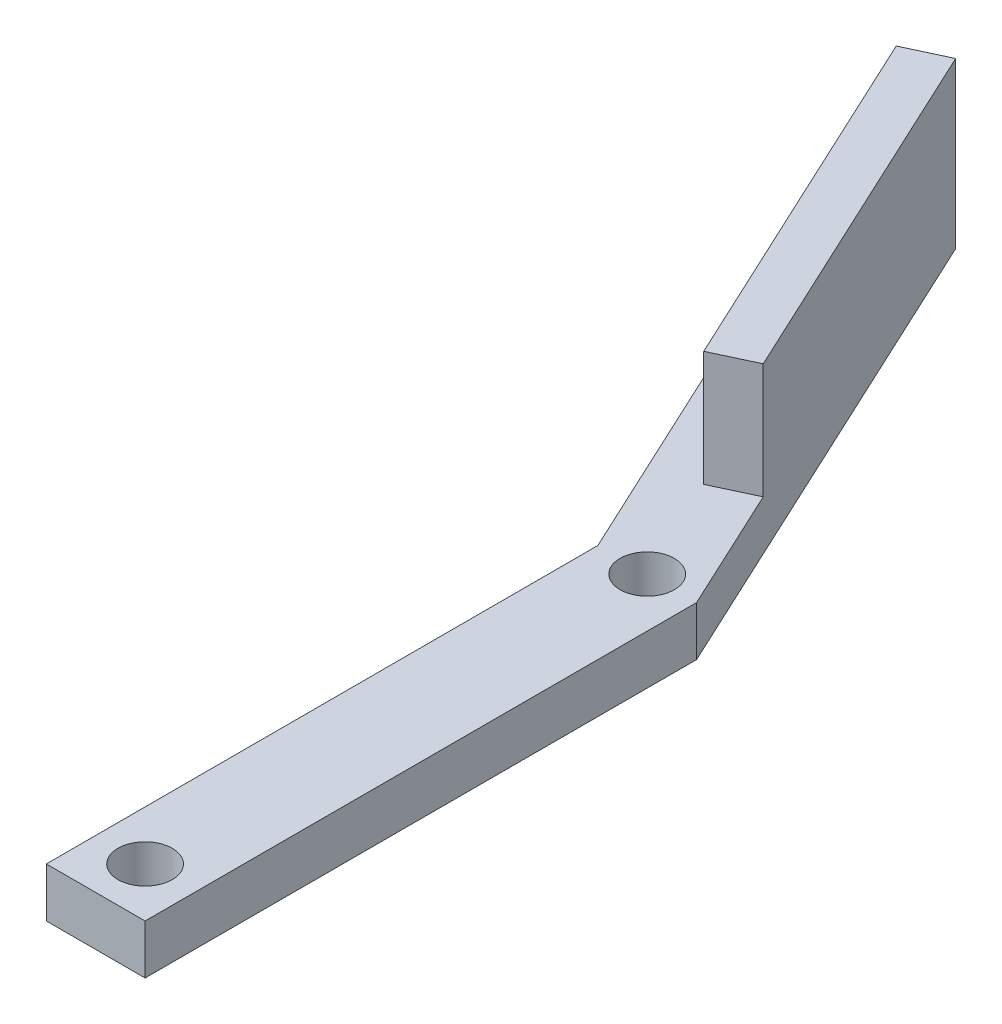
ISO-10303-21;
HEADER;
FILE_DESCRIPTION(('STEP AP214'),'2;1');
FILE_NAME('part.step','',(''),(''),'','','');
FILE_SCHEMA(('AUTOMOTIVE_DESIGN { 1 0 10303 214 1 1 1 1 }'));
ENDSEC;
DATA;
#1=APPLICATION_CONTEXT('core data for automotive mechanical design processes');
#2=APPLICATION_PROTOCOL_DEFINITION('international standard','automotive_design',2000,#1);
#3=PRODUCT_CONTEXT('',#1,'mechanical');
#4=PRODUCT('Part','Part','',(#3));
#5=PRODUCT_RELATED_PRODUCT_CATEGORY('part','',(#4));
#6=PRODUCT_DEFINITION_FORMATION('','',#4);
#7=PRODUCT_DEFINITION_CONTEXT('part definition',#1,'design');
#8=PRODUCT_DEFINITION('design','',#6,#7);
#9=PRODUCT_DEFINITION_SHAPE('','',#8);
#10=(LENGTH_UNIT() NAMED_UNIT(*) SI_UNIT(.MILLI.,.METRE.));
#11=(NAMED_UNIT(*) PLANE_ANGLE_UNIT() SI_UNIT($,.RADIAN.));
#12=(NAMED_UNIT(*) SI_UNIT($,.STERADIAN.) SOLID_ANGLE_UNIT());
#13=UNCERTAINTY_MEASURE_WITH_UNIT(LENGTH_MEASURE(1.E-05),#10,'distance_accuracy_value','');
#14=(GEOMETRIC_REPRESENTATION_CONTEXT(3) GLOBAL_UNCERTAINTY_ASSIGNED_CONTEXT((#13)) GLOBAL_UNIT_ASSIGNED_CONTEXT((#10,
#11,#12)) REPRESENTATION_CONTEXT('',''));
#15=CARTESIAN_POINT('',(0.,0.,0.));
#16=DIRECTION('',(0.,0.,1.));
#17=DIRECTION('',(1.,0.,0.));
#18=AXIS2_PLACEMENT_3D('',#15,#16,#17);
#19=CARTESIAN_POINT('',(-24.896544195256,3.,-53.3908113234974));
#20=DIRECTION('',(0.422618261740706,0.,0.906307787036647));
#21=DIRECTION('',(0.906307787036647,0.,-0.422618261740706));
#22=AXIS2_PLACEMENT_3D('',#19,#20,#21);
#23=PLANE('',#22);
#24=DIRECTION('',(-0.906307787036647,0.,0.422618261740706));
#25=VECTOR('',#24,1.);
#26=CARTESIAN_POINT('',(-24.896544195256,0.,-53.3908113234974));
#27=LINE('',#26,#25);
#28=CARTESIAN_POINT('',(-10.7501850231616,0.,-59.9873669404564));
#29=VERTEX_POINT('',#28);
#30=CARTESIAN_POINT('',(-15.6785478522212,0.,-57.6892336110994));
#31=VERTEX_POINT('',#30);
#32=EDGE_CURVE('E127',#29,#31,#27,.T.);
#33=ORIENTED_EDGE('',*,*,#32,.T.);
#34=DIRECTION('',(0.,-1.,0.));
#35=VECTOR('',#34,1.);
#36=CARTESIAN_POINT('',(-15.6785478522212,3.,-57.6892336110994));
#37=LINE('',#36,#35);
#38=CARTESIAN_POINT('',(-15.6785478522212,3.,-57.6892336110994));
#39=VERTEX_POINT('',#38);
#40=EDGE_CURVE('E11',#39,#31,#37,.T.);
#41=ORIENTED_EDGE('',*,*,#40,.F.);
#42=DIRECTION('',(-0.906307787036647,0.,0.422618261740706));
#43=VECTOR('',#42,1.);
#44=CARTESIAN_POINT('',(-24.896544195256,3.,-53.3908113234974));
#45=LINE('',#44,#43);
#46=CARTESIAN_POINT('',(-13.2143664376914,3.,-58.8383002757779));
#47=VERTEX_POINT('',#46);
#48=EDGE_CURVE('E113',#47,#39,#45,.T.);
#49=ORIENTED_EDGE('',*,*,#48,.F.);
#50=DIRECTION('',(0.,-1.,0.));
#51=VECTOR('',#50,1.);
#52=CARTESIAN_POINT('',(-13.2143664376914,10.,-58.8383002757779));
#53=LINE('',#52,#51);
#54=CARTESIAN_POINT('',(-13.2143664376914,10.,-58.8383002757779));
#55=VERTEX_POINT('',#54);
#56=EDGE_CURVE('E315',#55,#47,#53,.T.);
#57=ORIENTED_EDGE('',*,*,#56,.F.);
#58=DIRECTION('',(-0.906307787036647,0.,0.422618261740706));
#59=VECTOR('',#58,1.);
#60=CARTESIAN_POINT('',(-24.896544195256,10.,-53.3908113234974));
#61=LINE('',#60,#59);
#62=CARTESIAN_POINT('',(-10.7501850231616,10.,-59.9873669404564));
#63=VERTEX_POINT('',#62);
#64=EDGE_CURVE('E284',#63,#55,#61,.T.);
#65=ORIENTED_EDGE('',*,*,#64,.F.);
#66=DIRECTION('',(0.,-1.,0.));
#67=VECTOR('',#66,1.);
#68=CARTESIAN_POINT('',(-10.7501850231616,10.,-59.9873669404564));
#69=LINE('',#68,#67);
#70=EDGE_CURVE('E299',#63,#29,#69,.T.);
#71=ORIENTED_EDGE('',*,*,#70,.T.);
#72=EDGE_LOOP('',(#33,#41,#49,#57,#65,#71));
#73=FACE_BOUND('',#72,.T.);
#74=ADVANCED_FACE('F36',(#73),#23,.F.);
#75=CARTESIAN_POINT('',(9.21799634303479,3.,-4.29842228760199));
#76=DIRECTION('',(0.906307787036646,0.,-0.422618261740707));
#77=DIRECTION('',(-0.422618261740707,0.,-0.906307787036646));
#78=AXIS2_PLACEMENT_3D('',#75,#76,#77);
#79=PLANE('',#78);
#80=DIRECTION('',(0.422618261740707,0.,0.906307787036646));
#81=VECTOR('',#80,1.);
#82=CARTESIAN_POINT('',(9.21799634303479,0.,-4.29842228760199));
#83=LINE('',#82,#81);
#84=CARTESIAN_POINT('',(-3.,0.,-30.5));
#85=VERTEX_POINT('',#84);
#86=EDGE_CURVE('E131',#31,#85,#83,.T.);
#87=ORIENTED_EDGE('',*,*,#86,.T.);
#88=DIRECTION('',(0.,-1.,0.));
#89=VECTOR('',#88,1.);
#90=CARTESIAN_POINT('',(-3.,3.,-30.5));
#91=LINE('',#90,#89);
#92=CARTESIAN_POINT('',(-3.,3.,-30.5));
#93=VERTEX_POINT('',#92);
#94=EDGE_CURVE('E45',#93,#85,#91,.T.);
#95=ORIENTED_EDGE('',*,*,#94,.F.);
#96=DIRECTION('',(0.422618261740707,0.,0.906307787036646));
#97=VECTOR('',#96,1.);
#98=CARTESIAN_POINT('',(9.21799634303479,3.,-4.29842228760199));
#99=LINE('',#98,#97);
#100=EDGE_CURVE('E84',#39,#93,#99,.T.);
#101=ORIENTED_EDGE('',*,*,#100,.F.);
#102=ORIENTED_EDGE('',*,*,#40,.T.);
#103=EDGE_LOOP('',(#87,#95,#101,#102));
#104=FACE_BOUND('',#103,.T.);
#105=ADVANCED_FACE('F147',(#104),#79,.F.);
#106=CARTESIAN_POINT('',(-3.,3.,0.));
#107=DIRECTION('',(-1.,0.,0.));
#108=DIRECTION('',(0.,0.,1.));
#109=AXIS2_PLACEMENT_3D('',#106,#107,#108);
#110=PLANE('',#109);
#111=DIRECTION('',(0.,0.,-1.));
#112=VECTOR('',#111,1.);
#113=CARTESIAN_POINT('',(-3.,0.,0.));
#114=LINE('',#113,#112);
#115=CARTESIAN_POINT('',(-3.,0.,3.));
#116=VERTEX_POINT('',#115);
#117=EDGE_CURVE('E99',#116,#85,#114,.T.);
#118=ORIENTED_EDGE('',*,*,#117,.F.);
#119=DIRECTION('',(0.,-1.,0.));
#120=VECTOR('',#119,1.);
#121=CARTESIAN_POINT('',(-3.,3.,3.));
#122=LINE('',#121,#120);
#123=CARTESIAN_POINT('',(-3.,3.,3.));
#124=VERTEX_POINT('',#123);
#125=EDGE_CURVE('E93',#124,#116,#122,.T.);
#126=ORIENTED_EDGE('',*,*,#125,.F.);
#127=DIRECTION('',(0.,0.,-1.));
#128=VECTOR('',#127,1.);
#129=CARTESIAN_POINT('',(-3.,3.,0.));
#130=LINE('',#129,#128);
#131=EDGE_CURVE('E97',#124,#93,#130,.T.);
#132=ORIENTED_EDGE('',*,*,#131,.T.);
#133=ORIENTED_EDGE('',*,*,#94,.T.);
#134=EDGE_LOOP('',(#118,#126,#132,#133));
#135=FACE_BOUND('',#134,.T.);
#136=ADVANCED_FACE('F95',(#135),#110,.T.);
#137=CARTESIAN_POINT('',(0.,3.,3.));
#138=DIRECTION('',(0.,0.,-1.));
#139=DIRECTION('',(-1.,0.,0.));
#140=AXIS2_PLACEMENT_3D('',#137,#138,#139);
#141=PLANE('',#140);
#142=DIRECTION('',(1.,0.,0.));
#143=VECTOR('',#142,1.);
#144=CARTESIAN_POINT('',(0.,0.,3.));
#145=LINE('',#144,#143);
#146=CARTESIAN_POINT('',(3.,0.,3.));
#147=VERTEX_POINT('',#146);
#148=EDGE_CURVE('E135',#116,#147,#145,.T.);
#149=ORIENTED_EDGE('',*,*,#148,.T.);
#150=DIRECTION('',(0.,-1.,0.));
#151=VECTOR('',#150,1.);
#152=CARTESIAN_POINT('',(3.,3.,3.));
#153=LINE('',#152,#151);
#154=CARTESIAN_POINT('',(3.,3.,3.));
#155=VERTEX_POINT('',#154);
#156=EDGE_CURVE('E72',#155,#147,#153,.T.);
#157=ORIENTED_EDGE('',*,*,#156,.F.);
#158=DIRECTION('',(1.,0.,0.));
#159=VECTOR('',#158,1.);
#160=CARTESIAN_POINT('',(0.,3.,3.));
#161=LINE('',#160,#159);
#162=EDGE_CURVE('E103',#124,#155,#161,.T.);
#163=ORIENTED_EDGE('',*,*,#162,.F.);
#164=ORIENTED_EDGE('',*,*,#125,.T.);
#165=EDGE_LOOP('',(#149,#157,#163,#164));
#166=FACE_BOUND('',#165,.T.);
#167=ADVANCED_FACE('F104',(#166),#141,.F.);
#168=CARTESIAN_POINT('',(3.,3.,0.));
#169=DIRECTION('',(1.,0.,0.));
#170=DIRECTION('',(0.,0.,-1.));
#171=AXIS2_PLACEMENT_3D('',#168,#169,#170);
#172=PLANE('',#171);
#173=DIRECTION('',(0.,0.,1.));
#174=VECTOR('',#173,1.);
#175=CARTESIAN_POINT('',(3.,0.,0.));
#176=LINE('',#175,#174);
#177=CARTESIAN_POINT('',(3.,0.,-30.5));
#178=VERTEX_POINT('',#177);
#179=EDGE_CURVE('E137',#178,#147,#176,.T.);
#180=ORIENTED_EDGE('',*,*,#179,.F.);
#181=DIRECTION('',(0.,-1.,0.));
#182=VECTOR('',#181,1.);
#183=CARTESIAN_POINT('',(3.,3.,-30.5));
#184=LINE('',#183,#182);
#185=CARTESIAN_POINT('',(3.,3.,-30.5));
#186=VERTEX_POINT('',#185);
#187=EDGE_CURVE('E53',#186,#178,#184,.T.);
#188=ORIENTED_EDGE('',*,*,#187,.F.);
#189=DIRECTION('',(0.,0.,1.));
#190=VECTOR('',#189,1.);
#191=CARTESIAN_POINT('',(3.,3.,0.));
#192=LINE('',#191,#190);
#193=EDGE_CURVE('E107',#186,#155,#192,.T.);
#194=ORIENTED_EDGE('',*,*,#193,.T.);
#195=ORIENTED_EDGE('',*,*,#156,.T.);
#196=EDGE_LOOP('',(#180,#188,#194,#195));
#197=FACE_BOUND('',#196,.T.);
#198=ADVANCED_FACE('F153',(#197),#172,.T.);
#199=CARTESIAN_POINT('',(14.1463591720944,3.,-6.59655561695895));
#200=DIRECTION('',(-0.906307787036647,0.,0.422618261740707));
#201=DIRECTION('',(0.422618261740707,0.,0.906307787036647));
#202=AXIS2_PLACEMENT_3D('',#199,#200,#201);
#203=PLANE('',#202);
#204=DIRECTION('',(-0.422618261740707,0.,-0.906307787036646));
#205=VECTOR('',#204,1.);
#206=CARTESIAN_POINT('',(14.1463591720944,0.,-6.59655561695895));
#207=LINE('',#206,#205);
#208=EDGE_CURVE('E140',#178,#29,#207,.T.);
#209=ORIENTED_EDGE('',*,*,#208,.T.);
#210=ORIENTED_EDGE('',*,*,#70,.F.);
#211=DIRECTION('',(-0.422618261740707,0.,-0.906307787036646));
#212=VECTOR('',#211,1.);
#213=CARTESIAN_POINT('',(14.1463591720944,10.,-6.59655561695895));
#214=LINE('',#213,#212);
#215=CARTESIAN_POINT('',(-0.535818585470212,10.,-38.082587426207));
#216=VERTEX_POINT('',#215);
#217=EDGE_CURVE('E313',#216,#63,#214,.T.);
#218=ORIENTED_EDGE('',*,*,#217,.F.);
#219=DIRECTION('',(0.,-1.,0.));
#220=VECTOR('',#219,1.);
#221=CARTESIAN_POINT('',(-0.535818585470212,10.,-38.082587426207));
#222=LINE('',#221,#220);
#223=CARTESIAN_POINT('',(-0.535818585470212,3.,-38.082587426207));
#224=VERTEX_POINT('',#223);
#225=EDGE_CURVE('E296',#216,#224,#222,.T.);
#226=ORIENTED_EDGE('',*,*,#225,.T.);
#227=DIRECTION('',(-0.422618261740707,0.,-0.906307787036646));
#228=VECTOR('',#227,1.);
#229=CARTESIAN_POINT('',(14.1463591720944,3.,-6.59655561695895));
#230=LINE('',#229,#228);
#231=EDGE_CURVE('E118',#186,#224,#230,.T.);
#232=ORIENTED_EDGE('',*,*,#231,.F.);
#233=ORIENTED_EDGE('',*,*,#187,.T.);
#234=EDGE_LOOP('',(#209,#210,#218,#226,#232,#233));
#235=FACE_BOUND('',#234,.T.);
#236=ADVANCED_FACE('F155',(#235),#203,.F.);
#237=CARTESIAN_POINT('',(0.,3.,-30.5));
#238=DIRECTION('',(0.,-1.,0.));
#239=DIRECTION('',(0.,0.,-1.));
#240=AXIS2_PLACEMENT_3D('',#237,#238,#239);
#241=CYLINDRICAL_SURFACE('',#240,1.65);
#242=CARTESIAN_POINT('',(0.,3.,-30.5));
#243=DIRECTION('',(0.,1.,0.));
#244=DIRECTION('',(0.,0.,1.));
#245=AXIS2_PLACEMENT_3D('',#242,#243,#244);
#246=CIRCLE('',#245,1.65);
#247=CARTESIAN_POINT('',(0.,3.,-28.85));
#248=VERTEX_POINT('',#247);
#249=EDGE_CURVE('E145',#248,#248,#246,.T.);
#250=ORIENTED_EDGE('',*,*,#249,.T.);
#251=EDGE_LOOP('',(#250));
#252=FACE_BOUND('',#251,.T.);
#253=CARTESIAN_POINT('',(0.,0.,-30.5));
#254=DIRECTION('',(0.,1.,0.));
#255=DIRECTION('',(0.,0.,1.));
#256=AXIS2_PLACEMENT_3D('',#253,#254,#255);
#257=CIRCLE('',#256,1.65);
#258=CARTESIAN_POINT('',(0.,0.,-28.85));
#259=VERTEX_POINT('',#258);
#260=EDGE_CURVE('E124',#259,#259,#257,.T.);
#261=ORIENTED_EDGE('',*,*,#260,.F.);
#262=EDGE_LOOP('',(#261));
#263=FACE_BOUND('',#262,.T.);
#264=ADVANCED_FACE('F38',(#252,#263),#241,.F.);
#265=CARTESIAN_POINT('',(0.,3.,0.));
#266=DIRECTION('',(0.,-1.,0.));
#267=DIRECTION('',(0.,0.,-1.));
#268=AXIS2_PLACEMENT_3D('',#265,#266,#267);
#269=CYLINDRICAL_SURFACE('',#268,1.65);
#270=CARTESIAN_POINT('',(0.,3.,0.));
#271=DIRECTION('',(0.,1.,0.));
#272=DIRECTION('',(0.,0.,1.));
#273=AXIS2_PLACEMENT_3D('',#270,#271,#272);
#274=CIRCLE('',#273,1.65);
#275=CARTESIAN_POINT('',(0.,3.,1.65));
#276=VERTEX_POINT('',#275);
#277=EDGE_CURVE('E121',#276,#276,#274,.T.);
#278=ORIENTED_EDGE('',*,*,#277,.T.);
#279=EDGE_LOOP('',(#278));
#280=FACE_BOUND('',#279,.T.);
#281=CARTESIAN_POINT('',(0.,0.,0.));
#282=DIRECTION('',(0.,1.,0.));
#283=DIRECTION('',(0.,0.,1.));
#284=AXIS2_PLACEMENT_3D('',#281,#282,#283);
#285=CIRCLE('',#284,1.65);
#286=CARTESIAN_POINT('',(0.,0.,1.65));
#287=VERTEX_POINT('',#286);
#288=EDGE_CURVE('E142',#287,#287,#285,.T.);
#289=ORIENTED_EDGE('',*,*,#288,.F.);
#290=EDGE_LOOP('',(#289));
#291=FACE_BOUND('',#290,.T.);
#292=ADVANCED_FACE('F194',(#280,#291),#269,.F.);
#293=CARTESIAN_POINT('',(0.,3.,0.));
#294=DIRECTION('',(0.,1.,0.));
#295=DIRECTION('',(0.,0.,1.));
#296=AXIS2_PLACEMENT_3D('',#293,#294,#295);
#297=PLANE('',#296);
#298=ORIENTED_EDGE('',*,*,#249,.F.);
#299=EDGE_LOOP('',(#298));
#300=FACE_BOUND('',#299,.T.);
#301=DIRECTION('',(0.906307787036646,0.,-0.422618261740707));
#302=VECTOR('',#301,1.);
#303=CARTESIAN_POINT('',(-14.6821777575646,3.,-31.4860318092481));
#304=LINE('',#303,#302);
#305=CARTESIAN_POINT('',(-3.,3.,-36.9335207615285));
#306=VERTEX_POINT('',#305);
#307=EDGE_CURVE('E305',#306,#224,#304,.T.);
#308=ORIENTED_EDGE('',*,*,#307,.F.);
#309=DIRECTION('',(0.422618261740707,0.,0.906307787036646));
#310=VECTOR('',#309,1.);
#311=CARTESIAN_POINT('',(11.6821777575646,3.,-5.44748895228047));
#312=LINE('',#311,#310);
#313=EDGE_CURVE('E294',#47,#306,#312,.T.);
#314=ORIENTED_EDGE('',*,*,#313,.F.);
#315=ORIENTED_EDGE('',*,*,#48,.T.);
#316=ORIENTED_EDGE('',*,*,#100,.T.);
#317=ORIENTED_EDGE('',*,*,#131,.F.);
#318=ORIENTED_EDGE('',*,*,#162,.T.);
#319=ORIENTED_EDGE('',*,*,#193,.F.);
#320=ORIENTED_EDGE('',*,*,#231,.T.);
#321=EDGE_LOOP('',(#308,#314,#315,#316,#317,#318,#319,#320));
#322=FACE_BOUND('',#321,.T.);
#323=ORIENTED_EDGE('',*,*,#277,.F.);
#324=EDGE_LOOP('',(#323));
#325=FACE_BOUND('',#324,.T.);
#326=ADVANCED_FACE('F110',(#300,#322,#325),#297,.T.);
#327=CARTESIAN_POINT('',(0.,0.,0.));
#328=DIRECTION('',(0.,1.,0.));
#329=DIRECTION('',(0.,0.,1.));
#330=AXIS2_PLACEMENT_3D('',#327,#328,#329);
#331=PLANE('',#330);
#332=ORIENTED_EDGE('',*,*,#260,.T.);
#333=EDGE_LOOP('',(#332));
#334=FACE_BOUND('',#333,.T.);
#335=ORIENTED_EDGE('',*,*,#32,.F.);
#336=ORIENTED_EDGE('',*,*,#208,.F.);
#337=ORIENTED_EDGE('',*,*,#179,.T.);
#338=ORIENTED_EDGE('',*,*,#148,.F.);
#339=ORIENTED_EDGE('',*,*,#117,.T.);
#340=ORIENTED_EDGE('',*,*,#86,.F.);
#341=EDGE_LOOP('',(#335,#336,#337,#338,#339,#340));
#342=FACE_BOUND('',#341,.T.);
#343=ORIENTED_EDGE('',*,*,#288,.T.);
#344=EDGE_LOOP('',(#343));
#345=FACE_BOUND('',#344,.T.);
#346=ADVANCED_FACE('F151',(#334,#342,#345),#331,.F.);
#347=CARTESIAN_POINT('',(11.6821777575646,10.,-5.44748895228047));
#348=DIRECTION('',(0.906307787036647,0.,-0.422618261740707));
#349=DIRECTION('',(-0.422618261740707,0.,-0.906307787036646));
#350=AXIS2_PLACEMENT_3D('',#347,#348,#349);
#351=PLANE('',#350);
#352=ORIENTED_EDGE('',*,*,#313,.T.);
#353=DIRECTION('',(0.,-1.,0.));
#354=VECTOR('',#353,1.);
#355=CARTESIAN_POINT('',(-3.,10.,-36.9335207615285));
#356=LINE('',#355,#354);
#357=CARTESIAN_POINT('',(-3.,10.,-36.9335207615285));
#358=VERTEX_POINT('',#357);
#359=EDGE_CURVE('E128',#358,#306,#356,.T.);
#360=ORIENTED_EDGE('',*,*,#359,.F.);
#361=DIRECTION('',(0.422618261740707,0.,0.906307787036646));
#362=VECTOR('',#361,1.);
#363=CARTESIAN_POINT('',(11.6821777575646,10.,-5.44748895228047));
#364=LINE('',#363,#362);
#365=EDGE_CURVE('E275',#55,#358,#364,.T.);
#366=ORIENTED_EDGE('',*,*,#365,.F.);
#367=ORIENTED_EDGE('',*,*,#56,.T.);
#368=EDGE_LOOP('',(#352,#360,#366,#367));
#369=FACE_BOUND('',#368,.T.);
#370=ADVANCED_FACE('F236',(#369),#351,.F.);
#371=CARTESIAN_POINT('',(-14.6821777575646,10.,-31.4860318092481));
#372=DIRECTION('',(-0.422618261740707,0.,-0.906307787036647));
#373=DIRECTION('',(-0.906307787036647,0.,0.422618261740707));
#374=AXIS2_PLACEMENT_3D('',#371,#372,#373);
#375=PLANE('',#374);
#376=ORIENTED_EDGE('',*,*,#307,.T.);
#377=ORIENTED_EDGE('',*,*,#225,.F.);
#378=DIRECTION('',(0.906307787036646,0.,-0.422618261740707));
#379=VECTOR('',#378,1.);
#380=CARTESIAN_POINT('',(-14.6821777575646,10.,-31.4860318092481));
#381=LINE('',#380,#379);
#382=EDGE_CURVE('E280',#358,#216,#381,.T.);
#383=ORIENTED_EDGE('',*,*,#382,.F.);
#384=ORIENTED_EDGE('',*,*,#359,.T.);
#385=EDGE_LOOP('',(#376,#377,#383,#384));
#386=FACE_BOUND('',#385,.T.);
#387=ADVANCED_FACE('F246',(#386),#375,.F.);
#388=CARTESIAN_POINT('',(0.,10.,0.));
#389=DIRECTION('',(0.,1.,0.));
#390=DIRECTION('',(0.,0.,1.));
#391=AXIS2_PLACEMENT_3D('',#388,#389,#390);
#392=PLANE('',#391);
#393=ORIENTED_EDGE('',*,*,#365,.T.);
#394=ORIENTED_EDGE('',*,*,#382,.T.);
#395=ORIENTED_EDGE('',*,*,#217,.T.);
#396=ORIENTED_EDGE('',*,*,#64,.T.);
#397=EDGE_LOOP('',(#393,#394,#395,#396));
#398=FACE_BOUND('',#397,.T.);
#399=ADVANCED_FACE('F256',(#398),#392,.T.);
#400=CLOSED_SHELL('',(#74,#105,#136,#167,#198,#236,#264,#292,#326,#346,#370,#387,#399));
#401=MANIFOLD_SOLID_BREP('B2',#400);
#402=ADVANCED_BREP_SHAPE_REPRESENTATION('',(#18,#401),#14);
#403=SHAPE_DEFINITION_REPRESENTATION(#9,#402);
ENDSEC;
END-ISO-10303-21;
